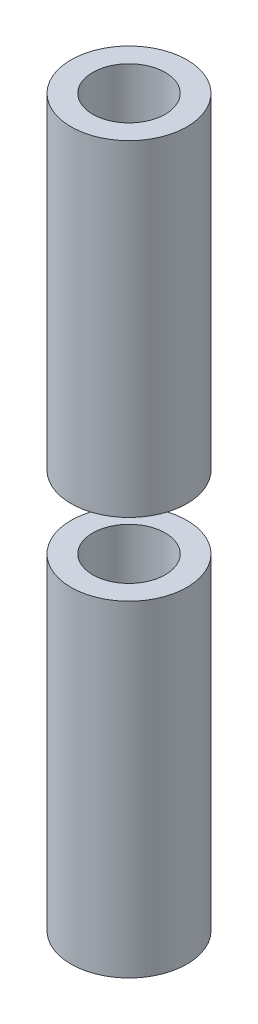
ISO-10303-21;
HEADER;
FILE_DESCRIPTION(('STEP AP214'),'2;1');
FILE_NAME('part.step','',(''),(''),'','','');
FILE_SCHEMA(('AUTOMOTIVE_DESIGN { 1 0 10303 214 1 1 1 1 }'));
ENDSEC;
DATA;
#1=APPLICATION_CONTEXT('core data for automotive mechanical design processes');
#2=APPLICATION_PROTOCOL_DEFINITION('international standard','automotive_design',2000,#1);
#3=PRODUCT_CONTEXT('',#1,'mechanical');
#4=PRODUCT('Part','Part','',(#3));
#5=PRODUCT_RELATED_PRODUCT_CATEGORY('part','',(#4));
#6=PRODUCT_DEFINITION_FORMATION('','',#4);
#7=PRODUCT_DEFINITION_CONTEXT('part definition',#1,'design');
#8=PRODUCT_DEFINITION('design','',#6,#7);
#9=PRODUCT_DEFINITION_SHAPE('','',#8);
#10=(LENGTH_UNIT() NAMED_UNIT(*) SI_UNIT(.MILLI.,.METRE.));
#11=(NAMED_UNIT(*) PLANE_ANGLE_UNIT() SI_UNIT($,.RADIAN.));
#12=(NAMED_UNIT(*) SI_UNIT($,.STERADIAN.) SOLID_ANGLE_UNIT());
#13=UNCERTAINTY_MEASURE_WITH_UNIT(LENGTH_MEASURE(1.E-05),#10,'distance_accuracy_value','');
#14=(GEOMETRIC_REPRESENTATION_CONTEXT(3) GLOBAL_UNCERTAINTY_ASSIGNED_CONTEXT((#13)) GLOBAL_UNIT_ASSIGNED_CONTEXT((#10,
#11,#12)) REPRESENTATION_CONTEXT('',''));
#15=CARTESIAN_POINT('',(0.,0.,0.));
#16=DIRECTION('',(0.,0.,1.));
#17=DIRECTION('',(1.,0.,0.));
#18=AXIS2_PLACEMENT_3D('',#15,#16,#17);
#19=CARTESIAN_POINT('',(0.,60.,0.));
#20=DIRECTION('',(0.,-1.,0.));
#21=DIRECTION('',(0.,0.,-1.));
#22=AXIS2_PLACEMENT_3D('',#19,#20,#21);
#23=CYLINDRICAL_SURFACE('',#22,4.);
#24=CARTESIAN_POINT('',(0.,55.,0.));
#25=DIRECTION('',(0.,-1.,0.));
#26=DIRECTION('',(0.,0.,-1.));
#27=AXIS2_PLACEMENT_3D('',#24,#25,#26);
#28=CIRCLE('',#27,4.);
#29=CARTESIAN_POINT('',(0.,55.,-4.));
#30=VERTEX_POINT('',#29);
#31=EDGE_CURVE('E57',#30,#30,#28,.F.);
#32=ORIENTED_EDGE('',*,*,#31,.F.);
#33=EDGE_LOOP('',(#32));
#34=FACE_BOUND('',#33,.T.);
#35=CARTESIAN_POINT('',(0.,32.5,0.));
#36=DIRECTION('',(0.,-1.,0.));
#37=DIRECTION('',(0.,0.,-1.));
#38=AXIS2_PLACEMENT_3D('',#35,#36,#37);
#39=CIRCLE('',#38,4.);
#40=CARTESIAN_POINT('',(0.,32.5,-4.));
#41=VERTEX_POINT('',#40);
#42=EDGE_CURVE('E11',#41,#41,#39,.T.);
#43=ORIENTED_EDGE('',*,*,#42,.F.);
#44=EDGE_LOOP('',(#43));
#45=FACE_BOUND('',#44,.T.);
#46=ADVANCED_FACE('F44',(#34,#45),#23,.T.);
#47=CARTESIAN_POINT('',(-2.5,32.5,0.));
#48=DIRECTION('',(0.,1.,0.));
#49=DIRECTION('',(0.,0.,1.));
#50=AXIS2_PLACEMENT_3D('',#47,#48,#49);
#51=PLANE('',#50);
#52=CARTESIAN_POINT('',(0.,32.5,0.));
#53=DIRECTION('',(0.,1.,0.));
#54=DIRECTION('',(0.,0.,1.));
#55=AXIS2_PLACEMENT_3D('',#52,#53,#54);
#56=CIRCLE('',#55,2.5);
#57=CARTESIAN_POINT('',(0.,32.5,2.5));
#58=VERTEX_POINT('',#57);
#59=EDGE_CURVE('E52',#58,#58,#56,.T.);
#60=ORIENTED_EDGE('',*,*,#59,.T.);
#61=EDGE_LOOP('',(#60));
#62=FACE_BOUND('',#61,.T.);
#63=ORIENTED_EDGE('',*,*,#42,.T.);
#64=EDGE_LOOP('',(#63));
#65=FACE_BOUND('',#64,.T.);
#66=ADVANCED_FACE('F46',(#62,#65),#51,.F.);
#67=CARTESIAN_POINT('',(0.,0.,0.));
#68=DIRECTION('',(0.,1.,0.));
#69=DIRECTION('',(0.,0.,1.));
#70=AXIS2_PLACEMENT_3D('',#67,#68,#69);
#71=CYLINDRICAL_SURFACE('',#70,2.5);
#72=CARTESIAN_POINT('',(0.,55.,0.));
#73=DIRECTION('',(0.,-1.,0.));
#74=DIRECTION('',(0.,0.,-1.));
#75=AXIS2_PLACEMENT_3D('',#72,#73,#74);
#76=CIRCLE('',#75,2.5);
#77=CARTESIAN_POINT('',(0.,55.,-2.5));
#78=VERTEX_POINT('',#77);
#79=EDGE_CURVE('E48',#78,#78,#76,.F.);
#80=ORIENTED_EDGE('',*,*,#79,.T.);
#81=EDGE_LOOP('',(#80));
#82=FACE_BOUND('',#81,.T.);
#83=ORIENTED_EDGE('',*,*,#59,.F.);
#84=EDGE_LOOP('',(#83));
#85=FACE_BOUND('',#84,.T.);
#86=ADVANCED_FACE('F65',(#82,#85),#71,.F.);
#87=CARTESIAN_POINT('',(-4.,55.,-4.));
#88=DIRECTION('',(0.,-1.,0.));
#89=DIRECTION('',(0.,0.,-1.));
#90=AXIS2_PLACEMENT_3D('',#87,#88,#89);
#91=PLANE('',#90);
#92=ORIENTED_EDGE('',*,*,#31,.T.);
#93=EDGE_LOOP('',(#92));
#94=FACE_BOUND('',#93,.T.);
#95=ORIENTED_EDGE('',*,*,#79,.F.);
#96=EDGE_LOOP('',(#95));
#97=FACE_BOUND('',#96,.T.);
#98=ADVANCED_FACE('F68',(#94,#97),#91,.F.);
#99=CLOSED_SHELL('',(#46,#66,#86,#98));
#100=MANIFOLD_SOLID_BREP('B2',#99);
#101=CARTESIAN_POINT('',(0.,0.,0.));
#102=DIRECTION('',(0.,1.,0.));
#103=DIRECTION('',(0.,0.,1.));
#104=AXIS2_PLACEMENT_3D('',#101,#102,#103);
#105=CYLINDRICAL_SURFACE('',#104,4.);
#106=CARTESIAN_POINT('',(0.,5.,0.));
#107=DIRECTION('',(0.,1.,0.));
#108=DIRECTION('',(0.,0.,1.));
#109=AXIS2_PLACEMENT_3D('',#106,#107,#108);
#110=CIRCLE('',#109,4.);
#111=CARTESIAN_POINT('',(0.,5.,4.));
#112=VERTEX_POINT('',#111);
#113=EDGE_CURVE('E129',#112,#112,#110,.F.);
#114=ORIENTED_EDGE('',*,*,#113,.F.);
#115=EDGE_LOOP('',(#114));
#116=FACE_BOUND('',#115,.T.);
#117=CARTESIAN_POINT('',(0.,27.5,0.));
#118=DIRECTION('',(0.,1.,0.));
#119=DIRECTION('',(0.,0.,1.));
#120=AXIS2_PLACEMENT_3D('',#117,#118,#119);
#121=CIRCLE('',#120,4.);
#122=CARTESIAN_POINT('',(0.,27.5,4.));
#123=VERTEX_POINT('',#122);
#124=EDGE_CURVE('E43',#123,#123,#121,.T.);
#125=ORIENTED_EDGE('',*,*,#124,.F.);
#126=EDGE_LOOP('',(#125));
#127=FACE_BOUND('',#126,.T.);
#128=ADVANCED_FACE('F116',(#116,#127),#105,.T.);
#129=CARTESIAN_POINT('',(-2.5,27.5,0.));
#130=DIRECTION('',(0.,1.,0.));
#131=DIRECTION('',(0.,0.,1.));
#132=AXIS2_PLACEMENT_3D('',#129,#130,#131);
#133=PLANE('',#132);
#134=CARTESIAN_POINT('',(0.,27.5,0.));
#135=DIRECTION('',(0.,1.,0.));
#136=DIRECTION('',(0.,0.,1.));
#137=AXIS2_PLACEMENT_3D('',#134,#135,#136);
#138=CIRCLE('',#137,2.5);
#139=CARTESIAN_POINT('',(0.,27.5,2.5));
#140=VERTEX_POINT('',#139);
#141=EDGE_CURVE('E124',#140,#140,#138,.T.);
#142=ORIENTED_EDGE('',*,*,#141,.F.);
#143=EDGE_LOOP('',(#142));
#144=FACE_BOUND('',#143,.T.);
#145=ORIENTED_EDGE('',*,*,#124,.T.);
#146=EDGE_LOOP('',(#145));
#147=FACE_BOUND('',#146,.T.);
#148=ADVANCED_FACE('F118',(#144,#147),#133,.T.);
#149=CARTESIAN_POINT('',(0.,0.,0.));
#150=DIRECTION('',(0.,1.,0.));
#151=DIRECTION('',(0.,0.,1.));
#152=AXIS2_PLACEMENT_3D('',#149,#150,#151);
#153=CYLINDRICAL_SURFACE('',#152,2.5);
#154=CARTESIAN_POINT('',(0.,5.,0.));
#155=DIRECTION('',(0.,1.,0.));
#156=DIRECTION('',(0.,0.,1.));
#157=AXIS2_PLACEMENT_3D('',#154,#155,#156);
#158=CIRCLE('',#157,2.5);
#159=CARTESIAN_POINT('',(0.,5.,2.5));
#160=VERTEX_POINT('',#159);
#161=EDGE_CURVE('E120',#160,#160,#158,.F.);
#162=ORIENTED_EDGE('',*,*,#161,.T.);
#163=EDGE_LOOP('',(#162));
#164=FACE_BOUND('',#163,.T.);
#165=ORIENTED_EDGE('',*,*,#141,.T.);
#166=EDGE_LOOP('',(#165));
#167=FACE_BOUND('',#166,.T.);
#168=ADVANCED_FACE('F137',(#164,#167),#153,.F.);
#169=CARTESIAN_POINT('',(-4.,5.,4.));
#170=DIRECTION('',(0.,1.,0.));
#171=DIRECTION('',(0.,0.,1.));
#172=AXIS2_PLACEMENT_3D('',#169,#170,#171);
#173=PLANE('',#172);
#174=ORIENTED_EDGE('',*,*,#113,.T.);
#175=EDGE_LOOP('',(#174));
#176=FACE_BOUND('',#175,.T.);
#177=ORIENTED_EDGE('',*,*,#161,.F.);
#178=EDGE_LOOP('',(#177));
#179=FACE_BOUND('',#178,.T.);
#180=ADVANCED_FACE('F140',(#176,#179),#173,.F.);
#181=CLOSED_SHELL('',(#128,#148,#168,#180));
#182=MANIFOLD_SOLID_BREP('B6',#181);
#183=ADVANCED_BREP_SHAPE_REPRESENTATION('',(#18,#100,#182),#14);
#184=SHAPE_DEFINITION_REPRESENTATION(#9,#183);
ENDSEC;
END-ISO-10303-21;
